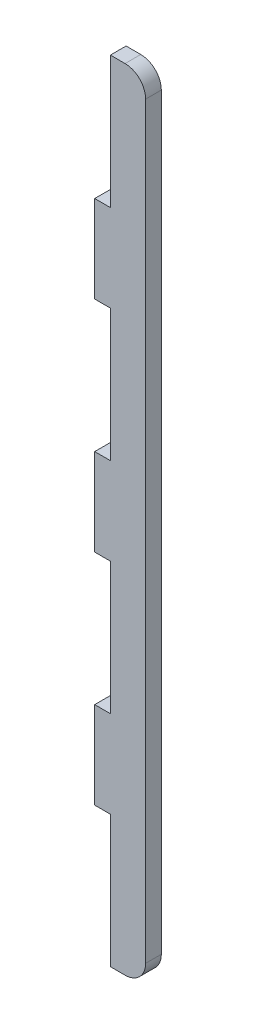
ISO-10303-21;
HEADER;
FILE_DESCRIPTION(('STEP AP214'),'2;1');
FILE_NAME('part.step','',(''),(''),'','','');
FILE_SCHEMA(('AUTOMOTIVE_DESIGN { 1 0 10303 214 1 1 1 1 }'));
ENDSEC;
DATA;
#1=APPLICATION_CONTEXT('core data for automotive mechanical design processes');
#2=APPLICATION_PROTOCOL_DEFINITION('international standard','automotive_design',2000,#1);
#3=PRODUCT_CONTEXT('',#1,'mechanical');
#4=PRODUCT('Part','Part','',(#3));
#5=PRODUCT_RELATED_PRODUCT_CATEGORY('part','',(#4));
#6=PRODUCT_DEFINITION_FORMATION('','',#4);
#7=PRODUCT_DEFINITION_CONTEXT('part definition',#1,'design');
#8=PRODUCT_DEFINITION('design','',#6,#7);
#9=PRODUCT_DEFINITION_SHAPE('','',#8);
#10=(LENGTH_UNIT() NAMED_UNIT(*) SI_UNIT(.MILLI.,.METRE.));
#11=(NAMED_UNIT(*) PLANE_ANGLE_UNIT() SI_UNIT($,.RADIAN.));
#12=(NAMED_UNIT(*) SI_UNIT($,.STERADIAN.) SOLID_ANGLE_UNIT());
#13=UNCERTAINTY_MEASURE_WITH_UNIT(LENGTH_MEASURE(1.E-05),#10,'distance_accuracy_value','');
#14=(GEOMETRIC_REPRESENTATION_CONTEXT(3) GLOBAL_UNCERTAINTY_ASSIGNED_CONTEXT((#13)) GLOBAL_UNIT_ASSIGNED_CONTEXT((#10,
#11,#12)) REPRESENTATION_CONTEXT('',''));
#15=CARTESIAN_POINT('',(0.,0.,0.));
#16=DIRECTION('',(0.,0.,1.));
#17=DIRECTION('',(1.,0.,0.));
#18=AXIS2_PLACEMENT_3D('',#15,#16,#17);
#19=CARTESIAN_POINT('',(10.3500003293,7.00000000000001,5.35));
#20=DIRECTION('',(0.,0.,-1.));
#21=DIRECTION('',(-1.,0.,0.));
#22=AXIS2_PLACEMENT_3D('',#19,#20,#21);
#23=CYLINDRICAL_SURFACE('',#22,6.99999999999999);
#24=CARTESIAN_POINT('',(10.3500003293,7.00000000000001,0.));
#25=DIRECTION('',(0.,0.,1.));
#26=DIRECTION('',(1.,0.,0.));
#27=AXIS2_PLACEMENT_3D('',#24,#25,#26);
#28=CIRCLE('',#27,6.99999999999999);
#29=CARTESIAN_POINT('',(10.3500001132,0.,0.));
#30=VERTEX_POINT('',#29);
#31=CARTESIAN_POINT('',(17.3500003293,7.00000000000001,0.));
#32=VERTEX_POINT('',#31);
#33=EDGE_CURVE('E189',#30,#32,#28,.T.);
#34=ORIENTED_EDGE('',*,*,#33,.T.);
#35=DIRECTION('',(0.,0.,-1.));
#36=VECTOR('',#35,1.);
#37=CARTESIAN_POINT('',(17.3500003293,7.00000000000001,5.35));
#38=LINE('',#37,#36);
#39=CARTESIAN_POINT('',(17.3500003293,7.00000000000001,5.35));
#40=VERTEX_POINT('',#39);
#41=EDGE_CURVE('E11',#40,#32,#38,.T.);
#42=ORIENTED_EDGE('',*,*,#41,.F.);
#43=CARTESIAN_POINT('',(10.3500003293,7.00000000000001,5.35));
#44=DIRECTION('',(0.,0.,1.));
#45=DIRECTION('',(1.,0.,0.));
#46=AXIS2_PLACEMENT_3D('',#43,#44,#45);
#47=CIRCLE('',#46,6.99999999999999);
#48=CARTESIAN_POINT('',(10.3500001132,0.,5.35));
#49=VERTEX_POINT('',#48);
#50=EDGE_CURVE('E223',#49,#40,#47,.T.);
#51=ORIENTED_EDGE('',*,*,#50,.F.);
#52=DIRECTION('',(0.,0.,-1.));
#53=VECTOR('',#52,1.);
#54=CARTESIAN_POINT('',(10.3500001132,0.,5.35));
#55=LINE('',#54,#53);
#56=EDGE_CURVE('E185',#49,#30,#55,.T.);
#57=ORIENTED_EDGE('',*,*,#56,.T.);
#58=EDGE_LOOP('',(#34,#42,#51,#57));
#59=FACE_BOUND('',#58,.T.);
#60=ADVANCED_FACE('F33',(#59),#23,.T.);
#61=CARTESIAN_POINT('',(17.3500003293,7.00000000000001,5.35));
#62=DIRECTION('',(-1.,0.,0.));
#63=DIRECTION('',(0.,0.,1.));
#64=AXIS2_PLACEMENT_3D('',#61,#62,#63);
#65=PLANE('',#64);
#66=DIRECTION('',(0.,1.,0.));
#67=VECTOR('',#66,1.);
#68=CARTESIAN_POINT('',(17.3500003293,7.00000000000001,0.));
#69=LINE('',#68,#67);
#70=CARTESIAN_POINT('',(17.3500003292999,261.999993585,0.));
#71=VERTEX_POINT('',#70);
#72=EDGE_CURVE('E192',#32,#71,#69,.T.);
#73=ORIENTED_EDGE('',*,*,#72,.T.);
#74=DIRECTION('',(0.,0.,-1.));
#75=VECTOR('',#74,1.);
#76=CARTESIAN_POINT('',(17.3500003292999,261.999993585,5.35));
#77=LINE('',#76,#75);
#78=CARTESIAN_POINT('',(17.3500003292999,261.999993585,5.35));
#79=VERTEX_POINT('',#78);
#80=EDGE_CURVE('E41',#79,#71,#77,.T.);
#81=ORIENTED_EDGE('',*,*,#80,.F.);
#82=DIRECTION('',(0.,1.,0.));
#83=VECTOR('',#82,1.);
#84=CARTESIAN_POINT('',(17.3500003293,7.00000000000001,5.35));
#85=LINE('',#84,#83);
#86=EDGE_CURVE('E122',#40,#79,#85,.T.);
#87=ORIENTED_EDGE('',*,*,#86,.F.);
#88=ORIENTED_EDGE('',*,*,#41,.T.);
#89=EDGE_LOOP('',(#73,#81,#87,#88));
#90=FACE_BOUND('',#89,.T.);
#91=ADVANCED_FACE('F331',(#90),#65,.F.);
#92=CARTESIAN_POINT('',(10.3500003293,261.9999938011,5.35));
#93=DIRECTION('',(0.,0.,-1.));
#94=DIRECTION('',(-1.,0.,0.));
#95=AXIS2_PLACEMENT_3D('',#92,#93,#94);
#96=CYLINDRICAL_SURFACE('',#95,6.99999999999995);
#97=CARTESIAN_POINT('',(10.3500003293,261.9999938011,0.));
#98=DIRECTION('',(0.,0.,1.));
#99=DIRECTION('',(1.,0.,0.));
#100=AXIS2_PLACEMENT_3D('',#97,#98,#99);
#101=CIRCLE('',#100,6.99999999999995);
#102=CARTESIAN_POINT('',(10.3500003293,268.9999938011,0.));
#103=VERTEX_POINT('',#102);
#104=EDGE_CURVE('E194',#71,#103,#101,.T.);
#105=ORIENTED_EDGE('',*,*,#104,.T.);
#106=DIRECTION('',(0.,0.,-1.));
#107=VECTOR('',#106,1.);
#108=CARTESIAN_POINT('',(10.3500003293,268.9999938011,5.35));
#109=LINE('',#108,#107);
#110=CARTESIAN_POINT('',(10.3500003293,268.9999938011,5.35));
#111=VERTEX_POINT('',#110);
#112=EDGE_CURVE('E260',#111,#103,#109,.T.);
#113=ORIENTED_EDGE('',*,*,#112,.F.);
#114=CARTESIAN_POINT('',(10.3500003293,261.9999938011,5.35));
#115=DIRECTION('',(0.,0.,1.));
#116=DIRECTION('',(1.,0.,0.));
#117=AXIS2_PLACEMENT_3D('',#114,#115,#116);
#118=CIRCLE('',#117,6.99999999999995);
#119=EDGE_CURVE('E268',#79,#111,#118,.T.);
#120=ORIENTED_EDGE('',*,*,#119,.F.);
#121=ORIENTED_EDGE('',*,*,#80,.T.);
#122=EDGE_LOOP('',(#105,#113,#120,#121));
#123=FACE_BOUND('',#122,.T.);
#124=ADVANCED_FACE('F266',(#123),#96,.T.);
#125=CARTESIAN_POINT('',(10.3500003293,268.9999938011,5.35));
#126=DIRECTION('',(0.,-1.,0.));
#127=DIRECTION('',(0.,0.,-1.));
#128=AXIS2_PLACEMENT_3D('',#125,#126,#127);
#129=PLANE('',#128);
#130=DIRECTION('',(-1.,0.,0.));
#131=VECTOR('',#130,1.);
#132=CARTESIAN_POINT('',(10.3500003293,268.9999938011,0.));
#133=LINE('',#132,#131);
#134=CARTESIAN_POINT('',(5.350000225,268.9999938011,0.));
#135=VERTEX_POINT('',#134);
#136=EDGE_CURVE('E196',#103,#135,#133,.T.);
#137=ORIENTED_EDGE('',*,*,#136,.T.);
#138=DIRECTION('',(0.,0.,-1.));
#139=VECTOR('',#138,1.);
#140=CARTESIAN_POINT('',(5.350000225,268.9999938011,5.35));
#141=LINE('',#140,#139);
#142=CARTESIAN_POINT('',(5.350000225,268.9999938011,5.35));
#143=VERTEX_POINT('',#142);
#144=EDGE_CURVE('E257',#143,#135,#141,.T.);
#145=ORIENTED_EDGE('',*,*,#144,.F.);
#146=DIRECTION('',(-1.,0.,0.));
#147=VECTOR('',#146,1.);
#148=CARTESIAN_POINT('',(10.3500003293,268.9999938011,5.35));
#149=LINE('',#148,#147);
#150=EDGE_CURVE('E286',#111,#143,#149,.T.);
#151=ORIENTED_EDGE('',*,*,#150,.F.);
#152=ORIENTED_EDGE('',*,*,#112,.T.);
#153=EDGE_LOOP('',(#137,#145,#151,#152));
#154=FACE_BOUND('',#153,.T.);
#155=ADVANCED_FACE('F277',(#154),#129,.F.);
#156=CARTESIAN_POINT('',(5.350000225,268.9999938011,5.35));
#157=DIRECTION('',(1.,0.,0.));
#158=DIRECTION('',(0.,0.,-1.));
#159=AXIS2_PLACEMENT_3D('',#156,#157,#158);
#160=PLANE('',#159);
#161=DIRECTION('',(0.,-1.,0.));
#162=VECTOR('',#161,1.);
#163=CARTESIAN_POINT('',(5.350000225,268.9999938011,0.));
#164=LINE('',#163,#162);
#165=CARTESIAN_POINT('',(5.350000225,223.9999920129,0.));
#166=VERTEX_POINT('',#165);
#167=EDGE_CURVE('E198',#135,#166,#164,.T.);
#168=ORIENTED_EDGE('',*,*,#167,.T.);
#169=DIRECTION('',(0.,0.,-1.));
#170=VECTOR('',#169,1.);
#171=CARTESIAN_POINT('',(5.350000225,223.9999920129,5.35));
#172=LINE('',#171,#170);
#173=CARTESIAN_POINT('',(5.350000225,223.9999920129,5.35));
#174=VERTEX_POINT('',#173);
#175=EDGE_CURVE('E254',#174,#166,#172,.T.);
#176=ORIENTED_EDGE('',*,*,#175,.F.);
#177=DIRECTION('',(0.,-1.,0.));
#178=VECTOR('',#177,1.);
#179=CARTESIAN_POINT('',(5.350000225,268.9999938011,5.35));
#180=LINE('',#179,#178);
#181=EDGE_CURVE('E283',#143,#174,#180,.T.);
#182=ORIENTED_EDGE('',*,*,#181,.F.);
#183=ORIENTED_EDGE('',*,*,#144,.T.);
#184=EDGE_LOOP('',(#168,#176,#182,#183));
#185=FACE_BOUND('',#184,.T.);
#186=ADVANCED_FACE('F281',(#185),#160,.F.);
#187=CARTESIAN_POINT('',(5.350000225,223.9999920129,5.35));
#188=DIRECTION('',(0.,-1.,0.));
#189=DIRECTION('',(0.,0.,-1.));
#190=AXIS2_PLACEMENT_3D('',#187,#188,#189);
#191=PLANE('',#190);
#192=DIRECTION('',(-1.,0.,0.));
#193=VECTOR('',#192,1.);
#194=CARTESIAN_POINT('',(5.350000225,223.9999920129,0.));
#195=LINE('',#194,#193);
#196=CARTESIAN_POINT('',(0.,223.9999920129,0.));
#197=VERTEX_POINT('',#196);
#198=EDGE_CURVE('E200',#166,#197,#195,.T.);
#199=ORIENTED_EDGE('',*,*,#198,.T.);
#200=DIRECTION('',(0.,0.,-1.));
#201=VECTOR('',#200,1.);
#202=CARTESIAN_POINT('',(0.,223.9999920129,5.35));
#203=LINE('',#202,#201);
#204=CARTESIAN_POINT('',(0.,223.9999920129,5.35));
#205=VERTEX_POINT('',#204);
#206=EDGE_CURVE('E251',#205,#197,#203,.T.);
#207=ORIENTED_EDGE('',*,*,#206,.F.);
#208=DIRECTION('',(-1.,0.,0.));
#209=VECTOR('',#208,1.);
#210=CARTESIAN_POINT('',(5.350000225,223.9999920129,5.35));
#211=LINE('',#210,#209);
#212=EDGE_CURVE('E285',#174,#205,#211,.T.);
#213=ORIENTED_EDGE('',*,*,#212,.F.);
#214=ORIENTED_EDGE('',*,*,#175,.T.);
#215=EDGE_LOOP('',(#199,#207,#213,#214));
#216=FACE_BOUND('',#215,.T.);
#217=ADVANCED_FACE('F344',(#216),#191,.F.);
#218=CARTESIAN_POINT('',(0.,223.9999920129,5.35));
#219=DIRECTION('',(1.,0.,0.));
#220=DIRECTION('',(0.,0.,-1.));
#221=AXIS2_PLACEMENT_3D('',#218,#219,#220);
#222=PLANE('',#221);
#223=DIRECTION('',(0.,-1.,0.));
#224=VECTOR('',#223,1.);
#225=CARTESIAN_POINT('',(0.,223.9999920129,0.));
#226=LINE('',#225,#224);
#227=CARTESIAN_POINT('',(0.,194.3333297968,0.));
#228=VERTEX_POINT('',#227);
#229=EDGE_CURVE('E202',#197,#228,#226,.T.);
#230=ORIENTED_EDGE('',*,*,#229,.T.);
#231=DIRECTION('',(0.,0.,-1.));
#232=VECTOR('',#231,1.);
#233=CARTESIAN_POINT('',(0.,194.3333297968,5.35));
#234=LINE('',#233,#232);
#235=CARTESIAN_POINT('',(0.,194.3333297968,5.35));
#236=VERTEX_POINT('',#235);
#237=EDGE_CURVE('E248',#236,#228,#234,.T.);
#238=ORIENTED_EDGE('',*,*,#237,.F.);
#239=DIRECTION('',(0.,-1.,0.));
#240=VECTOR('',#239,1.);
#241=CARTESIAN_POINT('',(0.,223.9999920129,5.35));
#242=LINE('',#241,#240);
#243=EDGE_CURVE('E288',#205,#236,#242,.T.);
#244=ORIENTED_EDGE('',*,*,#243,.F.);
#245=ORIENTED_EDGE('',*,*,#206,.T.);
#246=EDGE_LOOP('',(#230,#238,#244,#245));
#247=FACE_BOUND('',#246,.T.);
#248=ADVANCED_FACE('F347',(#247),#222,.F.);
#249=CARTESIAN_POINT('',(0.,194.3333297968,5.35));
#250=DIRECTION('',(0.,1.,0.));
#251=DIRECTION('',(0.,0.,1.));
#252=AXIS2_PLACEMENT_3D('',#249,#250,#251);
#253=PLANE('',#252);
#254=DIRECTION('',(1.,0.,0.));
#255=VECTOR('',#254,1.);
#256=CARTESIAN_POINT('',(0.,194.3333297968,0.));
#257=LINE('',#256,#255);
#258=CARTESIAN_POINT('',(5.350000225,194.3333297968,0.));
#259=VERTEX_POINT('',#258);
#260=EDGE_CURVE('E204',#228,#259,#257,.T.);
#261=ORIENTED_EDGE('',*,*,#260,.T.);
#262=DIRECTION('',(0.,0.,-1.));
#263=VECTOR('',#262,1.);
#264=CARTESIAN_POINT('',(5.350000225,194.3333297968,5.35));
#265=LINE('',#264,#263);
#266=CARTESIAN_POINT('',(5.350000225,194.3333297968,5.35));
#267=VERTEX_POINT('',#266);
#268=EDGE_CURVE('E245',#267,#259,#265,.T.);
#269=ORIENTED_EDGE('',*,*,#268,.F.);
#270=DIRECTION('',(1.,0.,0.));
#271=VECTOR('',#270,1.);
#272=CARTESIAN_POINT('',(0.,194.3333297968,5.35));
#273=LINE('',#272,#271);
#274=EDGE_CURVE('E294',#236,#267,#273,.T.);
#275=ORIENTED_EDGE('',*,*,#274,.F.);
#276=ORIENTED_EDGE('',*,*,#237,.T.);
#277=EDGE_LOOP('',(#261,#269,#275,#276));
#278=FACE_BOUND('',#277,.T.);
#279=ADVANCED_FACE('F351',(#278),#253,.F.);
#280=CARTESIAN_POINT('',(5.350000225,194.3333297968,5.35));
#281=DIRECTION('',(1.,0.,0.));
#282=DIRECTION('',(0.,0.,-1.));
#283=AXIS2_PLACEMENT_3D('',#280,#281,#282);
#284=PLANE('',#283);
#285=DIRECTION('',(0.,-1.,0.));
#286=VECTOR('',#285,1.);
#287=CARTESIAN_POINT('',(5.350000225,194.3333297968,0.));
#288=LINE('',#287,#286);
#289=CARTESIAN_POINT('',(5.350000225,149.3333280086,0.));
#290=VERTEX_POINT('',#289);
#291=EDGE_CURVE('E206',#259,#290,#288,.T.);
#292=ORIENTED_EDGE('',*,*,#291,.T.);
#293=DIRECTION('',(0.,0.,-1.));
#294=VECTOR('',#293,1.);
#295=CARTESIAN_POINT('',(5.350000225,149.3333280086,5.35));
#296=LINE('',#295,#294);
#297=CARTESIAN_POINT('',(5.350000225,149.3333280086,5.35));
#298=VERTEX_POINT('',#297);
#299=EDGE_CURVE('E242',#298,#290,#296,.T.);
#300=ORIENTED_EDGE('',*,*,#299,.F.);
#301=DIRECTION('',(0.,-1.,0.));
#302=VECTOR('',#301,1.);
#303=CARTESIAN_POINT('',(5.350000225,194.3333297968,5.35));
#304=LINE('',#303,#302);
#305=EDGE_CURVE('E296',#267,#298,#304,.T.);
#306=ORIENTED_EDGE('',*,*,#305,.F.);
#307=ORIENTED_EDGE('',*,*,#268,.T.);
#308=EDGE_LOOP('',(#292,#300,#306,#307));
#309=FACE_BOUND('',#308,.T.);
#310=ADVANCED_FACE('F355',(#309),#284,.F.);
#311=CARTESIAN_POINT('',(5.350000225,149.3333280086,5.35));
#312=DIRECTION('',(0.,-1.,0.));
#313=DIRECTION('',(0.,0.,-1.));
#314=AXIS2_PLACEMENT_3D('',#311,#312,#313);
#315=PLANE('',#314);
#316=DIRECTION('',(-1.,0.,0.));
#317=VECTOR('',#316,1.);
#318=CARTESIAN_POINT('',(5.350000225,149.3333280086,0.));
#319=LINE('',#318,#317);
#320=CARTESIAN_POINT('',(0.,149.3333280086,0.));
#321=VERTEX_POINT('',#320);
#322=EDGE_CURVE('E208',#290,#321,#319,.T.);
#323=ORIENTED_EDGE('',*,*,#322,.T.);
#324=DIRECTION('',(0.,0.,-1.));
#325=VECTOR('',#324,1.);
#326=CARTESIAN_POINT('',(0.,149.3333280086,5.35));
#327=LINE('',#326,#325);
#328=CARTESIAN_POINT('',(0.,149.3333280086,5.35));
#329=VERTEX_POINT('',#328);
#330=EDGE_CURVE('E239',#329,#321,#327,.T.);
#331=ORIENTED_EDGE('',*,*,#330,.F.);
#332=DIRECTION('',(-1.,0.,0.));
#333=VECTOR('',#332,1.);
#334=CARTESIAN_POINT('',(5.350000225,149.3333280086,5.35));
#335=LINE('',#334,#333);
#336=EDGE_CURVE('E298',#298,#329,#335,.T.);
#337=ORIENTED_EDGE('',*,*,#336,.F.);
#338=ORIENTED_EDGE('',*,*,#299,.T.);
#339=EDGE_LOOP('',(#323,#331,#337,#338));
#340=FACE_BOUND('',#339,.T.);
#341=ADVANCED_FACE('F359',(#340),#315,.F.);
#342=CARTESIAN_POINT('',(0.,149.3333280086,5.35));
#343=DIRECTION('',(1.,0.,0.));
#344=DIRECTION('',(0.,0.,-1.));
#345=AXIS2_PLACEMENT_3D('',#342,#343,#344);
#346=PLANE('',#345);
#347=DIRECTION('',(0.,-1.,0.));
#348=VECTOR('',#347,1.);
#349=CARTESIAN_POINT('',(0.,149.3333280086,0.));
#350=LINE('',#349,#348);
#351=CARTESIAN_POINT('',(0.,119.6666657924,0.));
#352=VERTEX_POINT('',#351);
#353=EDGE_CURVE('E210',#321,#352,#350,.T.);
#354=ORIENTED_EDGE('',*,*,#353,.T.);
#355=DIRECTION('',(0.,0.,-1.));
#356=VECTOR('',#355,1.);
#357=CARTESIAN_POINT('',(0.,119.6666657924,5.35));
#358=LINE('',#357,#356);
#359=CARTESIAN_POINT('',(0.,119.6666657924,5.35));
#360=VERTEX_POINT('',#359);
#361=EDGE_CURVE('E236',#360,#352,#358,.T.);
#362=ORIENTED_EDGE('',*,*,#361,.F.);
#363=DIRECTION('',(0.,-1.,0.));
#364=VECTOR('',#363,1.);
#365=CARTESIAN_POINT('',(0.,149.3333280086,5.35));
#366=LINE('',#365,#364);
#367=EDGE_CURVE('E300',#329,#360,#366,.T.);
#368=ORIENTED_EDGE('',*,*,#367,.F.);
#369=ORIENTED_EDGE('',*,*,#330,.T.);
#370=EDGE_LOOP('',(#354,#362,#368,#369));
#371=FACE_BOUND('',#370,.T.);
#372=ADVANCED_FACE('F363',(#371),#346,.F.);
#373=CARTESIAN_POINT('',(0.,119.6666657924,5.35));
#374=DIRECTION('',(0.,1.,0.));
#375=DIRECTION('',(0.,0.,1.));
#376=AXIS2_PLACEMENT_3D('',#373,#374,#375);
#377=PLANE('',#376);
#378=DIRECTION('',(1.,0.,0.));
#379=VECTOR('',#378,1.);
#380=CARTESIAN_POINT('',(0.,119.6666657924,0.));
#381=LINE('',#380,#379);
#382=CARTESIAN_POINT('',(5.350000225,119.6666657924,0.));
#383=VERTEX_POINT('',#382);
#384=EDGE_CURVE('E212',#352,#383,#381,.T.);
#385=ORIENTED_EDGE('',*,*,#384,.T.);
#386=DIRECTION('',(0.,0.,-1.));
#387=VECTOR('',#386,1.);
#388=CARTESIAN_POINT('',(5.350000225,119.6666657924,5.35));
#389=LINE('',#388,#387);
#390=CARTESIAN_POINT('',(5.350000225,119.6666657924,5.35));
#391=VERTEX_POINT('',#390);
#392=EDGE_CURVE('E233',#391,#383,#389,.T.);
#393=ORIENTED_EDGE('',*,*,#392,.F.);
#394=DIRECTION('',(1.,0.,0.));
#395=VECTOR('',#394,1.);
#396=CARTESIAN_POINT('',(0.,119.6666657924,5.35));
#397=LINE('',#396,#395);
#398=EDGE_CURVE('E302',#360,#391,#397,.T.);
#399=ORIENTED_EDGE('',*,*,#398,.F.);
#400=ORIENTED_EDGE('',*,*,#361,.T.);
#401=EDGE_LOOP('',(#385,#393,#399,#400));
#402=FACE_BOUND('',#401,.T.);
#403=ADVANCED_FACE('F367',(#402),#377,.F.);
#404=CARTESIAN_POINT('',(5.350000225,119.6666657924,5.35));
#405=DIRECTION('',(1.,0.,0.));
#406=DIRECTION('',(0.,0.,-1.));
#407=AXIS2_PLACEMENT_3D('',#404,#405,#406);
#408=PLANE('',#407);
#409=DIRECTION('',(0.,-1.,0.));
#410=VECTOR('',#409,1.);
#411=CARTESIAN_POINT('',(5.350000225,119.6666657924,0.));
#412=LINE('',#411,#410);
#413=CARTESIAN_POINT('',(5.350000225,74.6666640043,0.));
#414=VERTEX_POINT('',#413);
#415=EDGE_CURVE('E214',#383,#414,#412,.T.);
#416=ORIENTED_EDGE('',*,*,#415,.T.);
#417=DIRECTION('',(0.,0.,-1.));
#418=VECTOR('',#417,1.);
#419=CARTESIAN_POINT('',(5.350000225,74.6666640043,5.35));
#420=LINE('',#419,#418);
#421=CARTESIAN_POINT('',(5.350000225,74.6666640043,5.35));
#422=VERTEX_POINT('',#421);
#423=EDGE_CURVE('E230',#422,#414,#420,.T.);
#424=ORIENTED_EDGE('',*,*,#423,.F.);
#425=DIRECTION('',(0.,-1.,0.));
#426=VECTOR('',#425,1.);
#427=CARTESIAN_POINT('',(5.350000225,119.6666657924,5.35));
#428=LINE('',#427,#426);
#429=EDGE_CURVE('E304',#391,#422,#428,.T.);
#430=ORIENTED_EDGE('',*,*,#429,.F.);
#431=ORIENTED_EDGE('',*,*,#392,.T.);
#432=EDGE_LOOP('',(#416,#424,#430,#431));
#433=FACE_BOUND('',#432,.T.);
#434=ADVANCED_FACE('F371',(#433),#408,.F.);
#435=CARTESIAN_POINT('',(5.350000225,74.6666640043,5.35));
#436=DIRECTION('',(0.,-1.,0.));
#437=DIRECTION('',(0.,0.,-1.));
#438=AXIS2_PLACEMENT_3D('',#435,#436,#437);
#439=PLANE('',#438);
#440=DIRECTION('',(-1.,0.,0.));
#441=VECTOR('',#440,1.);
#442=CARTESIAN_POINT('',(5.350000225,74.6666640043,0.));
#443=LINE('',#442,#441);
#444=CARTESIAN_POINT('',(0.,74.6666640043,0.));
#445=VERTEX_POINT('',#444);
#446=EDGE_CURVE('E216',#414,#445,#443,.T.);
#447=ORIENTED_EDGE('',*,*,#446,.T.);
#448=DIRECTION('',(0.,0.,-1.));
#449=VECTOR('',#448,1.);
#450=CARTESIAN_POINT('',(0.,74.6666640043,5.35));
#451=LINE('',#450,#449);
#452=CARTESIAN_POINT('',(0.,74.6666640043,5.35));
#453=VERTEX_POINT('',#452);
#454=EDGE_CURVE('E227',#453,#445,#451,.T.);
#455=ORIENTED_EDGE('',*,*,#454,.F.);
#456=DIRECTION('',(-1.,0.,0.));
#457=VECTOR('',#456,1.);
#458=CARTESIAN_POINT('',(5.350000225,74.6666640043,5.35));
#459=LINE('',#458,#457);
#460=EDGE_CURVE('E306',#422,#453,#459,.T.);
#461=ORIENTED_EDGE('',*,*,#460,.F.);
#462=ORIENTED_EDGE('',*,*,#423,.T.);
#463=EDGE_LOOP('',(#447,#455,#461,#462));
#464=FACE_BOUND('',#463,.T.);
#465=ADVANCED_FACE('F312',(#464),#439,.F.);
#466=CARTESIAN_POINT('',(0.,74.6666640043,5.35));
#467=DIRECTION('',(1.,0.,0.));
#468=DIRECTION('',(0.,0.,-1.));
#469=AXIS2_PLACEMENT_3D('',#466,#467,#468);
#470=PLANE('',#469);
#471=DIRECTION('',(0.,-1.,0.));
#472=VECTOR('',#471,1.);
#473=CARTESIAN_POINT('',(0.,74.6666640043,0.));
#474=LINE('',#473,#472);
#475=CARTESIAN_POINT('',(0.,44.9999868869,0.));
#476=VERTEX_POINT('',#475);
#477=EDGE_CURVE('E218',#445,#476,#474,.T.);
#478=ORIENTED_EDGE('',*,*,#477,.T.);
#479=DIRECTION('',(0.,0.,-1.));
#480=VECTOR('',#479,1.);
#481=CARTESIAN_POINT('',(0.,44.9999868869,5.35));
#482=LINE('',#481,#480);
#483=CARTESIAN_POINT('',(0.,44.9999868869,5.35));
#484=VERTEX_POINT('',#483);
#485=EDGE_CURVE('E180',#484,#476,#482,.T.);
#486=ORIENTED_EDGE('',*,*,#485,.F.);
#487=DIRECTION('',(0.,-1.,0.));
#488=VECTOR('',#487,1.);
#489=CARTESIAN_POINT('',(0.,74.6666640043,5.35));
#490=LINE('',#489,#488);
#491=EDGE_CURVE('E171',#453,#484,#490,.T.);
#492=ORIENTED_EDGE('',*,*,#491,.F.);
#493=ORIENTED_EDGE('',*,*,#454,.T.);
#494=EDGE_LOOP('',(#478,#486,#492,#493));
#495=FACE_BOUND('',#494,.T.);
#496=ADVANCED_FACE('F316',(#495),#470,.F.);
#497=CARTESIAN_POINT('',(0.,44.9999868869,5.35));
#498=DIRECTION('',(0.,1.,0.));
#499=DIRECTION('',(0.,0.,1.));
#500=AXIS2_PLACEMENT_3D('',#497,#498,#499);
#501=PLANE('',#500);
#502=DIRECTION('',(1.,0.,0.));
#503=VECTOR('',#502,1.);
#504=CARTESIAN_POINT('',(0.,44.9999868869,0.));
#505=LINE('',#504,#503);
#506=CARTESIAN_POINT('',(5.350000225,44.9999868869,0.));
#507=VERTEX_POINT('',#506);
#508=EDGE_CURVE('E179',#476,#507,#505,.T.);
#509=ORIENTED_EDGE('',*,*,#508,.T.);
#510=DIRECTION('',(0.,0.,-1.));
#511=VECTOR('',#510,1.);
#512=CARTESIAN_POINT('',(5.350000225,44.9999868869,5.35));
#513=LINE('',#512,#511);
#514=CARTESIAN_POINT('',(5.350000225,44.9999868869,5.35));
#515=VERTEX_POINT('',#514);
#516=EDGE_CURVE('E176',#515,#507,#513,.T.);
#517=ORIENTED_EDGE('',*,*,#516,.F.);
#518=DIRECTION('',(1.,0.,0.));
#519=VECTOR('',#518,1.);
#520=CARTESIAN_POINT('',(0.,44.9999868869,5.35));
#521=LINE('',#520,#519);
#522=EDGE_CURVE('E165',#484,#515,#521,.T.);
#523=ORIENTED_EDGE('',*,*,#522,.F.);
#524=ORIENTED_EDGE('',*,*,#485,.T.);
#525=EDGE_LOOP('',(#509,#517,#523,#524));
#526=FACE_BOUND('',#525,.T.);
#527=ADVANCED_FACE('F177',(#526),#501,.F.);
#528=CARTESIAN_POINT('',(5.350000225,44.9999868869,5.35));
#529=DIRECTION('',(1.,0.,0.));
#530=DIRECTION('',(0.,0.,-1.));
#531=AXIS2_PLACEMENT_3D('',#528,#529,#530);
#532=PLANE('',#531);
#533=DIRECTION('',(0.,-1.,0.));
#534=VECTOR('',#533,1.);
#535=CARTESIAN_POINT('',(5.350000225,44.9999868869,0.));
#536=LINE('',#535,#534);
#537=CARTESIAN_POINT('',(5.350000225,0.,0.));
#538=VERTEX_POINT('',#537);
#539=EDGE_CURVE('E108',#507,#538,#536,.T.);
#540=ORIENTED_EDGE('',*,*,#539,.T.);
#541=DIRECTION('',(0.,0.,-1.));
#542=VECTOR('',#541,1.);
#543=CARTESIAN_POINT('',(5.350000225,0.,5.35));
#544=LINE('',#543,#542);
#545=CARTESIAN_POINT('',(5.350000225,0.,5.35));
#546=VERTEX_POINT('',#545);
#547=EDGE_CURVE('E181',#546,#538,#544,.T.);
#548=ORIENTED_EDGE('',*,*,#547,.F.);
#549=DIRECTION('',(0.,-1.,0.));
#550=VECTOR('',#549,1.);
#551=CARTESIAN_POINT('',(5.350000225,44.9999868869,5.35));
#552=LINE('',#551,#550);
#553=EDGE_CURVE('E169',#515,#546,#552,.T.);
#554=ORIENTED_EDGE('',*,*,#553,.F.);
#555=ORIENTED_EDGE('',*,*,#516,.T.);
#556=EDGE_LOOP('',(#540,#548,#554,#555));
#557=FACE_BOUND('',#556,.T.);
#558=ADVANCED_FACE('F183',(#557),#532,.F.);
#559=CARTESIAN_POINT('',(5.350000225,0.,5.35));
#560=DIRECTION('',(0.,1.,0.));
#561=DIRECTION('',(0.,0.,1.));
#562=AXIS2_PLACEMENT_3D('',#559,#560,#561);
#563=PLANE('',#562);
#564=DIRECTION('',(1.,0.,0.));
#565=VECTOR('',#564,1.);
#566=CARTESIAN_POINT('',(5.350000225,0.,0.));
#567=LINE('',#566,#565);
#568=EDGE_CURVE('E114',#538,#30,#567,.T.);
#569=ORIENTED_EDGE('',*,*,#568,.T.);
#570=ORIENTED_EDGE('',*,*,#56,.F.);
#571=DIRECTION('',(1.,0.,0.));
#572=VECTOR('',#571,1.);
#573=CARTESIAN_POINT('',(5.350000225,0.,5.35));
#574=LINE('',#573,#572);
#575=EDGE_CURVE('E49',#546,#49,#574,.T.);
#576=ORIENTED_EDGE('',*,*,#575,.F.);
#577=ORIENTED_EDGE('',*,*,#547,.T.);
#578=EDGE_LOOP('',(#569,#570,#576,#577));
#579=FACE_BOUND('',#578,.T.);
#580=ADVANCED_FACE('F320',(#579),#563,.F.);
#581=CARTESIAN_POINT('',(10.3500003293,7.00000000000001,5.35));
#582=DIRECTION('',(0.,0.,1.));
#583=DIRECTION('',(1.,0.,0.));
#584=AXIS2_PLACEMENT_3D('',#581,#582,#583);
#585=PLANE('',#584);
#586=ORIENTED_EDGE('',*,*,#50,.T.);
#587=ORIENTED_EDGE('',*,*,#86,.T.);
#588=ORIENTED_EDGE('',*,*,#119,.T.);
#589=ORIENTED_EDGE('',*,*,#150,.T.);
#590=ORIENTED_EDGE('',*,*,#181,.T.);
#591=ORIENTED_EDGE('',*,*,#212,.T.);
#592=ORIENTED_EDGE('',*,*,#243,.T.);
#593=ORIENTED_EDGE('',*,*,#274,.T.);
#594=ORIENTED_EDGE('',*,*,#305,.T.);
#595=ORIENTED_EDGE('',*,*,#336,.T.);
#596=ORIENTED_EDGE('',*,*,#367,.T.);
#597=ORIENTED_EDGE('',*,*,#398,.T.);
#598=ORIENTED_EDGE('',*,*,#429,.T.);
#599=ORIENTED_EDGE('',*,*,#460,.T.);
#600=ORIENTED_EDGE('',*,*,#491,.T.);
#601=ORIENTED_EDGE('',*,*,#522,.T.);
#602=ORIENTED_EDGE('',*,*,#553,.T.);
#603=ORIENTED_EDGE('',*,*,#575,.T.);
#604=EDGE_LOOP('',(#586,#587,#588,#589,#590,#591,#592,#593,#594,#595,#596,#597,#598,#599,#600,
#601,#602,#603));
#605=FACE_BOUND('',#604,.T.);
#606=ADVANCED_FACE('F167',(#605),#585,.T.);
#607=CARTESIAN_POINT('',(10.3500003293,7.00000000000001,0.));
#608=DIRECTION('',(0.,0.,1.));
#609=DIRECTION('',(1.,0.,0.));
#610=AXIS2_PLACEMENT_3D('',#607,#608,#609);
#611=PLANE('',#610);
#612=ORIENTED_EDGE('',*,*,#33,.F.);
#613=ORIENTED_EDGE('',*,*,#568,.F.);
#614=ORIENTED_EDGE('',*,*,#539,.F.);
#615=ORIENTED_EDGE('',*,*,#508,.F.);
#616=ORIENTED_EDGE('',*,*,#477,.F.);
#617=ORIENTED_EDGE('',*,*,#446,.F.);
#618=ORIENTED_EDGE('',*,*,#415,.F.);
#619=ORIENTED_EDGE('',*,*,#384,.F.);
#620=ORIENTED_EDGE('',*,*,#353,.F.);
#621=ORIENTED_EDGE('',*,*,#322,.F.);
#622=ORIENTED_EDGE('',*,*,#291,.F.);
#623=ORIENTED_EDGE('',*,*,#260,.F.);
#624=ORIENTED_EDGE('',*,*,#229,.F.);
#625=ORIENTED_EDGE('',*,*,#198,.F.);
#626=ORIENTED_EDGE('',*,*,#167,.F.);
#627=ORIENTED_EDGE('',*,*,#136,.F.);
#628=ORIENTED_EDGE('',*,*,#104,.F.);
#629=ORIENTED_EDGE('',*,*,#72,.F.);
#630=EDGE_LOOP('',(#612,#613,#614,#615,#616,#617,#618,#619,#620,#621,#622,#623,#624,#625,#626,
#627,#628,#629));
#631=FACE_BOUND('',#630,.T.);
#632=ADVANCED_FACE('F272',(#631),#611,.F.);
#633=CLOSED_SHELL('',(#60,#91,#124,#155,#186,#217,#248,#279,#310,#341,#372,#403,#434,#465,#496,
#527,#558,#580,#606,#632));
#634=MANIFOLD_SOLID_BREP('B2',#633);
#635=ADVANCED_BREP_SHAPE_REPRESENTATION('',(#18,#634),#14);
#636=SHAPE_DEFINITION_REPRESENTATION(#9,#635);
ENDSEC;
END-ISO-10303-21;
